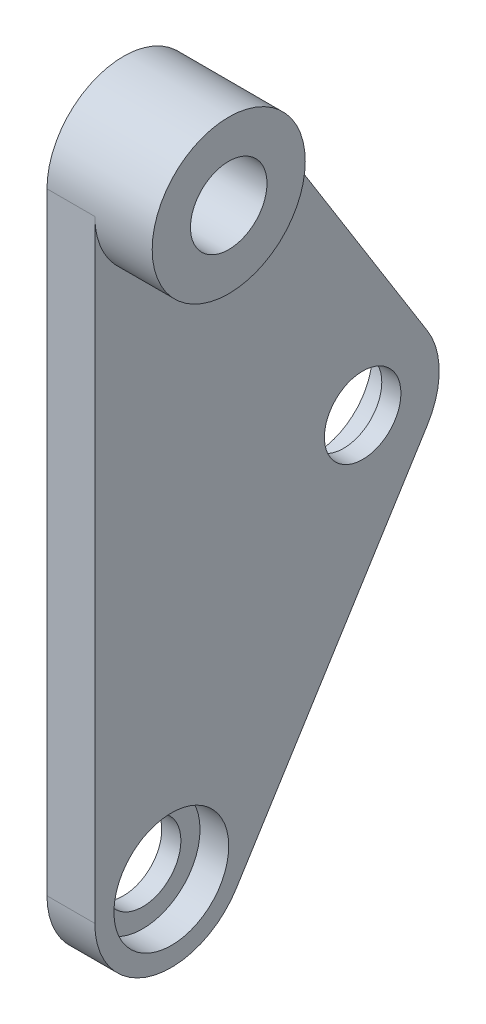
ISO-10303-21;
HEADER;
FILE_DESCRIPTION(('STEP AP214'),'2;1');
FILE_NAME('part.step','',(''),(''),'','','');
FILE_SCHEMA(('AUTOMOTIVE_DESIGN { 1 0 10303 214 1 1 1 1 }'));
ENDSEC;
DATA;
#1=APPLICATION_CONTEXT('core data for automotive mechanical design processes');
#2=APPLICATION_PROTOCOL_DEFINITION('international standard','automotive_design',2000,#1);
#3=PRODUCT_CONTEXT('',#1,'mechanical');
#4=PRODUCT('Part','Part','',(#3));
#5=PRODUCT_RELATED_PRODUCT_CATEGORY('part','',(#4));
#6=PRODUCT_DEFINITION_FORMATION('','',#4);
#7=PRODUCT_DEFINITION_CONTEXT('part definition',#1,'design');
#8=PRODUCT_DEFINITION('design','',#6,#7);
#9=PRODUCT_DEFINITION_SHAPE('','',#8);
#10=(LENGTH_UNIT() NAMED_UNIT(*) SI_UNIT(.MILLI.,.METRE.));
#11=(NAMED_UNIT(*) PLANE_ANGLE_UNIT() SI_UNIT($,.RADIAN.));
#12=(NAMED_UNIT(*) SI_UNIT($,.STERADIAN.) SOLID_ANGLE_UNIT());
#13=UNCERTAINTY_MEASURE_WITH_UNIT(LENGTH_MEASURE(1.E-05),#10,'distance_accuracy_value','');
#14=(GEOMETRIC_REPRESENTATION_CONTEXT(3) GLOBAL_UNCERTAINTY_ASSIGNED_CONTEXT((#13)) GLOBAL_UNIT_ASSIGNED_CONTEXT((#10,
#11,#12)) REPRESENTATION_CONTEXT('',''));
#15=CARTESIAN_POINT('',(0.,0.,0.));
#16=DIRECTION('',(0.,0.,1.));
#17=DIRECTION('',(1.,0.,0.));
#18=AXIS2_PLACEMENT_3D('',#15,#16,#17);
#19=CARTESIAN_POINT('',(4.5,-4.,-4.));
#20=DIRECTION('',(1.,0.,0.));
#21=DIRECTION('',(0.,0.,1.));
#22=AXIS2_PLACEMENT_3D('',#19,#20,#21);
#23=CYLINDRICAL_SURFACE('',#22,2.);
#24=CARTESIAN_POINT('',(10.,-4.,-4.));
#25=DIRECTION('',(1.,0.,0.));
#26=DIRECTION('',(0.,0.,-1.));
#27=AXIS2_PLACEMENT_3D('',#24,#25,#26);
#28=CIRCLE('',#27,2.);
#29=CARTESIAN_POINT('',(10.,-4.,-6.));
#30=VERTEX_POINT('',#29);
#31=EDGE_CURVE('E212',#30,#30,#28,.T.);
#32=ORIENTED_EDGE('',*,*,#31,.T.);
#33=EDGE_LOOP('',(#32));
#34=FACE_BOUND('',#33,.T.);
#35=CARTESIAN_POINT('',(6.,-4.,-4.));
#36=DIRECTION('',(1.,0.,0.));
#37=DIRECTION('',(0.,0.,-1.));
#38=AXIS2_PLACEMENT_3D('',#35,#36,#37);
#39=CIRCLE('',#38,2.);
#40=CARTESIAN_POINT('',(6.,-4.,-6.));
#41=VERTEX_POINT('',#40);
#42=EDGE_CURVE('E215',#41,#41,#39,.F.);
#43=ORIENTED_EDGE('',*,*,#42,.T.);
#44=EDGE_LOOP('',(#43));
#45=FACE_BOUND('',#44,.T.);
#46=ADVANCED_FACE('F102',(#34,#45),#23,.F.);
#47=CARTESIAN_POINT('',(4.5,-20.,-14.));
#48=DIRECTION('',(1.,0.,0.));
#49=DIRECTION('',(0.,0.,1.));
#50=AXIS2_PLACEMENT_3D('',#47,#48,#49);
#51=CYLINDRICAL_SURFACE('',#50,2.);
#52=CARTESIAN_POINT('',(7.,-20.,-14.));
#53=DIRECTION('',(1.,0.,0.));
#54=DIRECTION('',(0.,0.,-1.));
#55=AXIS2_PLACEMENT_3D('',#52,#53,#54);
#56=CIRCLE('',#55,2.);
#57=CARTESIAN_POINT('',(7.,-20.,-16.));
#58=VERTEX_POINT('',#57);
#59=EDGE_CURVE('E233',#58,#58,#56,.F.);
#60=ORIENTED_EDGE('',*,*,#59,.F.);
#61=EDGE_LOOP('',(#60));
#62=FACE_BOUND('',#61,.T.);
#63=CARTESIAN_POINT('',(6.,-20.,-14.));
#64=DIRECTION('',(1.,0.,0.));
#65=DIRECTION('',(0.,0.,-1.));
#66=AXIS2_PLACEMENT_3D('',#63,#64,#65);
#67=CIRCLE('',#66,2.);
#68=CARTESIAN_POINT('',(6.,-20.,-16.));
#69=VERTEX_POINT('',#68);
#70=EDGE_CURVE('E205',#69,#69,#67,.T.);
#71=ORIENTED_EDGE('',*,*,#70,.F.);
#72=EDGE_LOOP('',(#71));
#73=FACE_BOUND('',#72,.T.);
#74=ADVANCED_FACE('F256',(#62,#73),#51,.F.);
#75=CARTESIAN_POINT('',(4.5,2.79415306338351,-4.47064490141361));
#76=DIRECTION('',(0.,0.52999894000318,-0.847998304005088));
#77=DIRECTION('',(0.,0.847998304005088,0.52999894000318));
#78=AXIS2_PLACEMENT_3D('',#75,#76,#77);
#79=PLANE('',#78);
#80=DIRECTION('',(0.,-0.847998304005088,-0.52999894000318));
#81=VECTOR('',#80,1.);
#82=CARTESIAN_POINT('',(7.,2.79415306338351,-4.47064490141361));
#83=LINE('',#82,#81);
#84=CARTESIAN_POINT('',(7.,-1.88000423998728,-7.39199321602035));
#85=VERTEX_POINT('',#84);
#86=CARTESIAN_POINT('',(7.,-17.8800042399873,-17.3919932160204));
#87=VERTEX_POINT('',#86);
#88=EDGE_CURVE('E186',#85,#87,#83,.T.);
#89=ORIENTED_EDGE('',*,*,#88,.T.);
#90=DIRECTION('',(1.,0.,0.));
#91=VECTOR('',#90,1.);
#92=CARTESIAN_POINT('',(4.5,-17.8800042399873,-17.3919932160204));
#93=LINE('',#92,#91);
#94=CARTESIAN_POINT('',(4.5,-17.8800042399873,-17.3919932160204));
#95=VERTEX_POINT('',#94);
#96=EDGE_CURVE('E112',#95,#87,#93,.T.);
#97=ORIENTED_EDGE('',*,*,#96,.F.);
#98=DIRECTION('',(0.,-0.847998304005088,-0.52999894000318));
#99=VECTOR('',#98,1.);
#100=CARTESIAN_POINT('',(4.5,2.79415306338351,-4.47064490141361));
#101=LINE('',#100,#99);
#102=CARTESIAN_POINT('',(4.5,-1.88000423998728,-7.39199321602035));
#103=VERTEX_POINT('',#102);
#104=EDGE_CURVE('E179',#103,#95,#101,.T.);
#105=ORIENTED_EDGE('',*,*,#104,.F.);
#106=DIRECTION('',(1.,0.,0.));
#107=VECTOR('',#106,1.);
#108=CARTESIAN_POINT('',(4.5,-1.88000423998728,-7.39199321602035));
#109=LINE('',#108,#107);
#110=EDGE_CURVE('E197',#103,#85,#109,.T.);
#111=ORIENTED_EDGE('',*,*,#110,.T.);
#112=EDGE_LOOP('',(#89,#97,#105,#111));
#113=FACE_BOUND('',#112,.T.);
#114=ADVANCED_FACE('F262',(#113),#79,.T.);
#115=CARTESIAN_POINT('',(4.5,0.,0.));
#116=DIRECTION('',(0.,0.,-1.));
#117=DIRECTION('',(1.,0.,0.));
#118=AXIS2_PLACEMENT_3D('',#115,#116,#117);
#119=PLANE('',#118);
#120=DIRECTION('',(0.,-1.,0.));
#121=VECTOR('',#120,1.);
#122=CARTESIAN_POINT('',(7.,0.,0.));
#123=LINE('',#122,#121);
#124=CARTESIAN_POINT('',(7.,-4.,0.));
#125=VERTEX_POINT('',#124);
#126=CARTESIAN_POINT('',(7.,-36.,0.));
#127=VERTEX_POINT('',#126);
#128=EDGE_CURVE('E189',#125,#127,#123,.T.);
#129=ORIENTED_EDGE('',*,*,#128,.F.);
#130=DIRECTION('',(1.,0.,0.));
#131=VECTOR('',#130,1.);
#132=CARTESIAN_POINT('',(4.5,-4.,0.));
#133=LINE('',#132,#131);
#134=CARTESIAN_POINT('',(4.5,-4.,0.));
#135=VERTEX_POINT('',#134);
#136=EDGE_CURVE('E174',#135,#125,#133,.T.);
#137=ORIENTED_EDGE('',*,*,#136,.F.);
#138=DIRECTION('',(0.,-1.,0.));
#139=VECTOR('',#138,1.);
#140=CARTESIAN_POINT('',(4.5,0.,0.));
#141=LINE('',#140,#139);
#142=CARTESIAN_POINT('',(4.5,-36.,0.));
#143=VERTEX_POINT('',#142);
#144=EDGE_CURVE('E163',#135,#143,#141,.T.);
#145=ORIENTED_EDGE('',*,*,#144,.T.);
#146=DIRECTION('',(1.,0.,0.));
#147=VECTOR('',#146,1.);
#148=CARTESIAN_POINT('',(4.5,-36.,0.));
#149=LINE('',#148,#147);
#150=EDGE_CURVE('E171',#143,#127,#149,.T.);
#151=ORIENTED_EDGE('',*,*,#150,.T.);
#152=EDGE_LOOP('',(#129,#137,#145,#151));
#153=FACE_BOUND('',#152,.T.);
#154=ADVANCED_FACE('F177',(#153),#119,.F.);
#155=CARTESIAN_POINT('',(4.5,-14.0301081195633,-22.4481729913013));
#156=DIRECTION('',(0.,-0.52999894000318,-0.847998304005088));
#157=DIRECTION('',(0.,0.847998304005088,-0.52999894000318));
#158=AXIS2_PLACEMENT_3D('',#155,#156,#157);
#159=PLANE('',#158);
#160=DIRECTION('',(0.,-0.847998304005088,0.52999894000318));
#161=VECTOR('',#160,1.);
#162=CARTESIAN_POINT('',(7.,-14.0301081195633,-22.4481729913013));
#163=LINE('',#162,#161);
#164=CARTESIAN_POINT('',(7.,-22.1199957600127,-17.3919932160204));
#165=VERTEX_POINT('',#164);
#166=CARTESIAN_POINT('',(7.,-38.1199957600127,-7.39199321602035));
#167=VERTEX_POINT('',#166);
#168=EDGE_CURVE('E183',#165,#167,#163,.T.);
#169=ORIENTED_EDGE('',*,*,#168,.T.);
#170=DIRECTION('',(1.,0.,0.));
#171=VECTOR('',#170,1.);
#172=CARTESIAN_POINT('',(4.5,-38.1199957600127,-7.39199321602035));
#173=LINE('',#172,#171);
#174=CARTESIAN_POINT('',(4.5,-38.1199957600127,-7.39199321602035));
#175=VERTEX_POINT('',#174);
#176=EDGE_CURVE('E175',#175,#167,#173,.T.);
#177=ORIENTED_EDGE('',*,*,#176,.F.);
#178=DIRECTION('',(0.,-0.847998304005088,0.52999894000318));
#179=VECTOR('',#178,1.);
#180=CARTESIAN_POINT('',(4.5,-14.0301081195633,-22.4481729913013));
#181=LINE('',#180,#179);
#182=CARTESIAN_POINT('',(4.5,-22.1199957600127,-17.3919932160204));
#183=VERTEX_POINT('',#182);
#184=EDGE_CURVE('E166',#183,#175,#181,.T.);
#185=ORIENTED_EDGE('',*,*,#184,.F.);
#186=DIRECTION('',(1.,0.,0.));
#187=VECTOR('',#186,1.);
#188=CARTESIAN_POINT('',(4.5,-22.1199957600127,-17.3919932160204));
#189=LINE('',#188,#187);
#190=EDGE_CURVE('E181',#183,#165,#189,.T.);
#191=ORIENTED_EDGE('',*,*,#190,.T.);
#192=EDGE_LOOP('',(#169,#177,#185,#191));
#193=FACE_BOUND('',#192,.T.);
#194=ADVANCED_FACE('F280',(#193),#159,.T.);
#195=CARTESIAN_POINT('',(7.,0.,0.));
#196=DIRECTION('',(-1.,0.,0.));
#197=DIRECTION('',(0.,0.,-1.));
#198=AXIS2_PLACEMENT_3D('',#195,#196,#197);
#199=PLANE('',#198);
#200=CARTESIAN_POINT('',(7.,-36.,-4.));
#201=DIRECTION('',(1.,0.,0.));
#202=DIRECTION('',(0.,0.,-1.));
#203=AXIS2_PLACEMENT_3D('',#200,#201,#202);
#204=CIRCLE('',#203,3.);
#205=CARTESIAN_POINT('',(7.,-36.,-7.));
#206=VERTEX_POINT('',#205);
#207=EDGE_CURVE('E403',#206,#206,#204,.T.);
#208=ORIENTED_EDGE('',*,*,#207,.F.);
#209=EDGE_LOOP('',(#208));
#210=FACE_BOUND('',#209,.T.);
#211=ORIENTED_EDGE('',*,*,#59,.T.);
#212=EDGE_LOOP('',(#211));
#213=FACE_BOUND('',#212,.T.);
#214=ORIENTED_EDGE('',*,*,#128,.T.);
#215=CARTESIAN_POINT('',(7.,-36.,-4.));
#216=DIRECTION('',(1.,0.,0.));
#217=DIRECTION('',(0.,0.,-1.));
#218=AXIS2_PLACEMENT_3D('',#215,#216,#217);
#219=CIRCLE('',#218,4.);
#220=EDGE_CURVE('E141',#127,#167,#219,.T.);
#221=ORIENTED_EDGE('',*,*,#220,.T.);
#222=ORIENTED_EDGE('',*,*,#168,.F.);
#223=CARTESIAN_POINT('',(7.,-20.,-14.));
#224=DIRECTION('',(1.,0.,0.));
#225=DIRECTION('',(0.,0.,-1.));
#226=AXIS2_PLACEMENT_3D('',#223,#224,#225);
#227=CIRCLE('',#226,4.);
#228=EDGE_CURVE('E147',#165,#87,#227,.T.);
#229=ORIENTED_EDGE('',*,*,#228,.T.);
#230=ORIENTED_EDGE('',*,*,#88,.F.);
#231=CARTESIAN_POINT('',(7.,-4.,-4.));
#232=DIRECTION('',(1.,0.,0.));
#233=DIRECTION('',(0.,0.,-1.));
#234=AXIS2_PLACEMENT_3D('',#231,#232,#233);
#235=CIRCLE('',#234,4.);
#236=EDGE_CURVE('E12',#125,#85,#235,.T.);
#237=ORIENTED_EDGE('',*,*,#236,.F.);
#238=EDGE_LOOP('',(#214,#221,#222,#229,#230,#237));
#239=FACE_BOUND('',#238,.T.);
#240=ADVANCED_FACE('F276',(#210,#213,#239),#199,.F.);
#241=CARTESIAN_POINT('',(4.5,0.,0.));
#242=DIRECTION('',(-1.,0.,0.));
#243=DIRECTION('',(0.,0.,-1.));
#244=AXIS2_PLACEMENT_3D('',#241,#242,#243);
#245=PLANE('',#244);
#246=CARTESIAN_POINT('',(4.5,-4.,-4.));
#247=DIRECTION('',(1.,0.,0.));
#248=DIRECTION('',(0.,0.,-1.));
#249=AXIS2_PLACEMENT_3D('',#246,#247,#248);
#250=CIRCLE('',#249,3.);
#251=CARTESIAN_POINT('',(4.5,-4.,-7.));
#252=VERTEX_POINT('',#251);
#253=EDGE_CURVE('E220',#252,#252,#250,.T.);
#254=ORIENTED_EDGE('',*,*,#253,.T.);
#255=EDGE_LOOP('',(#254));
#256=FACE_BOUND('',#255,.T.);
#257=CARTESIAN_POINT('',(4.5,-20.,-14.));
#258=DIRECTION('',(1.,0.,0.));
#259=DIRECTION('',(0.,0.,-1.));
#260=AXIS2_PLACEMENT_3D('',#257,#258,#259);
#261=CIRCLE('',#260,3.);
#262=CARTESIAN_POINT('',(4.5,-20.,-17.));
#263=VERTEX_POINT('',#262);
#264=EDGE_CURVE('E226',#263,#263,#261,.T.);
#265=ORIENTED_EDGE('',*,*,#264,.T.);
#266=EDGE_LOOP('',(#265));
#267=FACE_BOUND('',#266,.T.);
#268=CARTESIAN_POINT('',(4.5,-36.,-4.));
#269=DIRECTION('',(1.,0.,0.));
#270=DIRECTION('',(0.,0.,-1.));
#271=AXIS2_PLACEMENT_3D('',#268,#269,#270);
#272=CIRCLE('',#271,2.);
#273=CARTESIAN_POINT('',(4.5,-36.,-6.));
#274=VERTEX_POINT('',#273);
#275=EDGE_CURVE('E207',#274,#274,#272,.T.);
#276=ORIENTED_EDGE('',*,*,#275,.T.);
#277=EDGE_LOOP('',(#276));
#278=FACE_BOUND('',#277,.T.);
#279=ORIENTED_EDGE('',*,*,#184,.T.);
#280=CARTESIAN_POINT('',(4.5,-36.,-4.));
#281=DIRECTION('',(1.,0.,0.));
#282=DIRECTION('',(0.,0.,-1.));
#283=AXIS2_PLACEMENT_3D('',#280,#281,#282);
#284=CIRCLE('',#283,4.);
#285=EDGE_CURVE('E159',#143,#175,#284,.T.);
#286=ORIENTED_EDGE('',*,*,#285,.F.);
#287=ORIENTED_EDGE('',*,*,#144,.F.);
#288=CARTESIAN_POINT('',(4.5,-4.,-4.));
#289=DIRECTION('',(1.,0.,0.));
#290=DIRECTION('',(0.,0.,-1.));
#291=AXIS2_PLACEMENT_3D('',#288,#289,#290);
#292=CIRCLE('',#291,4.);
#293=EDGE_CURVE('E190',#103,#135,#292,.T.);
#294=ORIENTED_EDGE('',*,*,#293,.F.);
#295=ORIENTED_EDGE('',*,*,#104,.T.);
#296=CARTESIAN_POINT('',(4.5,-20.,-14.));
#297=DIRECTION('',(1.,0.,0.));
#298=DIRECTION('',(0.,0.,-1.));
#299=AXIS2_PLACEMENT_3D('',#296,#297,#298);
#300=CIRCLE('',#299,4.);
#301=EDGE_CURVE('E121',#183,#95,#300,.T.);
#302=ORIENTED_EDGE('',*,*,#301,.F.);
#303=EDGE_LOOP('',(#279,#286,#287,#294,#295,#302));
#304=FACE_BOUND('',#303,.T.);
#305=ADVANCED_FACE('F161',(#256,#267,#278,#304),#245,.T.);
#306=CARTESIAN_POINT('',(4.5,-36.,-4.));
#307=DIRECTION('',(1.,0.,0.));
#308=DIRECTION('',(0.,0.,1.));
#309=AXIS2_PLACEMENT_3D('',#306,#307,#308);
#310=CYLINDRICAL_SURFACE('',#309,4.);
#311=ORIENTED_EDGE('',*,*,#285,.T.);
#312=ORIENTED_EDGE('',*,*,#176,.T.);
#313=ORIENTED_EDGE('',*,*,#220,.F.);
#314=ORIENTED_EDGE('',*,*,#150,.F.);
#315=EDGE_LOOP('',(#311,#312,#313,#314));
#316=FACE_BOUND('',#315,.T.);
#317=ADVANCED_FACE('F104',(#316),#310,.T.);
#318=CARTESIAN_POINT('',(4.5,-20.,-14.));
#319=DIRECTION('',(1.,0.,0.));
#320=DIRECTION('',(0.,0.,1.));
#321=AXIS2_PLACEMENT_3D('',#318,#319,#320);
#322=CYLINDRICAL_SURFACE('',#321,4.);
#323=ORIENTED_EDGE('',*,*,#228,.F.);
#324=ORIENTED_EDGE('',*,*,#190,.F.);
#325=ORIENTED_EDGE('',*,*,#301,.T.);
#326=ORIENTED_EDGE('',*,*,#96,.T.);
#327=EDGE_LOOP('',(#323,#324,#325,#326));
#328=FACE_BOUND('',#327,.T.);
#329=ADVANCED_FACE('F244',(#328),#322,.T.);
#330=CARTESIAN_POINT('',(4.5,-4.,-4.));
#331=DIRECTION('',(1.,0.,0.));
#332=DIRECTION('',(0.,0.,1.));
#333=AXIS2_PLACEMENT_3D('',#330,#331,#332);
#334=CYLINDRICAL_SURFACE('',#333,4.);
#335=ORIENTED_EDGE('',*,*,#293,.T.);
#336=ORIENTED_EDGE('',*,*,#136,.T.);
#337=ORIENTED_EDGE('',*,*,#236,.T.);
#338=ORIENTED_EDGE('',*,*,#110,.F.);
#339=EDGE_LOOP('',(#335,#336,#337,#338));
#340=FACE_BOUND('',#339,.T.);
#341=CARTESIAN_POINT('',(10.,-4.,-4.));
#342=DIRECTION('',(1.,0.,0.));
#343=DIRECTION('',(0.,0.,-1.));
#344=AXIS2_PLACEMENT_3D('',#341,#342,#343);
#345=CIRCLE('',#344,4.);
#346=CARTESIAN_POINT('',(10.,-4.,-8.));
#347=VERTEX_POINT('',#346);
#348=EDGE_CURVE('E204',#347,#347,#345,.T.);
#349=ORIENTED_EDGE('',*,*,#348,.F.);
#350=EDGE_LOOP('',(#349));
#351=FACE_BOUND('',#350,.T.);
#352=ADVANCED_FACE('F242',(#340,#351),#334,.T.);
#353=CARTESIAN_POINT('',(10.,-4.,-4.));
#354=DIRECTION('',(-1.,0.,0.));
#355=DIRECTION('',(0.,0.,-1.));
#356=AXIS2_PLACEMENT_3D('',#353,#354,#355);
#357=PLANE('',#356);
#358=ORIENTED_EDGE('',*,*,#31,.F.);
#359=EDGE_LOOP('',(#358));
#360=FACE_BOUND('',#359,.T.);
#361=ORIENTED_EDGE('',*,*,#348,.T.);
#362=EDGE_LOOP('',(#361));
#363=FACE_BOUND('',#362,.T.);
#364=ADVANCED_FACE('F240',(#360,#363),#357,.F.);
#365=CARTESIAN_POINT('',(4.5,-36.,-4.));
#366=DIRECTION('',(1.,0.,0.));
#367=DIRECTION('',(0.,0.,1.));
#368=AXIS2_PLACEMENT_3D('',#365,#366,#367);
#369=CYLINDRICAL_SURFACE('',#368,2.);
#370=CARTESIAN_POINT('',(5.5,-36.,-4.));
#371=DIRECTION('',(1.,0.,0.));
#372=DIRECTION('',(0.,0.,-1.));
#373=AXIS2_PLACEMENT_3D('',#370,#371,#372);
#374=CIRCLE('',#373,2.);
#375=CARTESIAN_POINT('',(5.5,-36.,-6.));
#376=VERTEX_POINT('',#375);
#377=EDGE_CURVE('E106',#376,#376,#374,.T.);
#378=ORIENTED_EDGE('',*,*,#377,.T.);
#379=EDGE_LOOP('',(#378));
#380=FACE_BOUND('',#379,.T.);
#381=ORIENTED_EDGE('',*,*,#275,.F.);
#382=EDGE_LOOP('',(#381));
#383=FACE_BOUND('',#382,.T.);
#384=ADVANCED_FACE('F251',(#380,#383),#369,.F.);
#385=CARTESIAN_POINT('',(6.,-20.,-14.));
#386=DIRECTION('',(-1.,0.,0.));
#387=DIRECTION('',(0.,0.,-1.));
#388=AXIS2_PLACEMENT_3D('',#385,#386,#387);
#389=CYLINDRICAL_SURFACE('',#388,3.);
#390=CARTESIAN_POINT('',(6.,-20.,-14.));
#391=DIRECTION('',(1.,0.,0.));
#392=DIRECTION('',(0.,0.,-1.));
#393=AXIS2_PLACEMENT_3D('',#390,#391,#392);
#394=CIRCLE('',#393,3.);
#395=CARTESIAN_POINT('',(6.,-20.,-17.));
#396=VERTEX_POINT('',#395);
#397=EDGE_CURVE('E229',#396,#396,#394,.T.);
#398=ORIENTED_EDGE('',*,*,#397,.T.);
#399=EDGE_LOOP('',(#398));
#400=FACE_BOUND('',#399,.T.);
#401=ORIENTED_EDGE('',*,*,#264,.F.);
#402=EDGE_LOOP('',(#401));
#403=FACE_BOUND('',#402,.T.);
#404=ADVANCED_FACE('F271',(#400,#403),#389,.F.);
#405=CARTESIAN_POINT('',(6.,-20.,-14.));
#406=DIRECTION('',(-1.,0.,0.));
#407=DIRECTION('',(0.,0.,-1.));
#408=AXIS2_PLACEMENT_3D('',#405,#406,#407);
#409=PLANE('',#408);
#410=ORIENTED_EDGE('',*,*,#70,.T.);
#411=EDGE_LOOP('',(#410));
#412=FACE_BOUND('',#411,.T.);
#413=ORIENTED_EDGE('',*,*,#397,.F.);
#414=EDGE_LOOP('',(#413));
#415=FACE_BOUND('',#414,.T.);
#416=ADVANCED_FACE('F267',(#412,#415),#409,.T.);
#417=CARTESIAN_POINT('',(6.,-4.,-4.));
#418=DIRECTION('',(-1.,0.,0.));
#419=DIRECTION('',(0.,0.,-1.));
#420=AXIS2_PLACEMENT_3D('',#417,#418,#419);
#421=CYLINDRICAL_SURFACE('',#420,3.);
#422=CARTESIAN_POINT('',(6.,-4.,-4.));
#423=DIRECTION('',(1.,0.,0.));
#424=DIRECTION('',(0.,0.,-1.));
#425=AXIS2_PLACEMENT_3D('',#422,#423,#424);
#426=CIRCLE('',#425,3.);
#427=CARTESIAN_POINT('',(6.,-4.,-7.));
#428=VERTEX_POINT('',#427);
#429=EDGE_CURVE('E208',#428,#428,#426,.T.);
#430=ORIENTED_EDGE('',*,*,#429,.T.);
#431=EDGE_LOOP('',(#430));
#432=FACE_BOUND('',#431,.T.);
#433=ORIENTED_EDGE('',*,*,#253,.F.);
#434=EDGE_LOOP('',(#433));
#435=FACE_BOUND('',#434,.T.);
#436=ADVANCED_FACE('F356',(#432,#435),#421,.F.);
#437=CARTESIAN_POINT('',(6.,0.,0.));
#438=DIRECTION('',(-1.,0.,0.));
#439=DIRECTION('',(0.,0.,-1.));
#440=AXIS2_PLACEMENT_3D('',#437,#438,#439);
#441=PLANE('',#440);
#442=ORIENTED_EDGE('',*,*,#42,.F.);
#443=EDGE_LOOP('',(#442));
#444=FACE_BOUND('',#443,.T.);
#445=ORIENTED_EDGE('',*,*,#429,.F.);
#446=EDGE_LOOP('',(#445));
#447=FACE_BOUND('',#446,.T.);
#448=ADVANCED_FACE('F364',(#444,#447),#441,.T.);
#449=CARTESIAN_POINT('',(5.5,-36.,-4.));
#450=DIRECTION('',(1.,0.,0.));
#451=DIRECTION('',(0.,0.,1.));
#452=AXIS2_PLACEMENT_3D('',#449,#450,#451);
#453=CYLINDRICAL_SURFACE('',#452,3.);
#454=CARTESIAN_POINT('',(5.5,-36.,-4.));
#455=DIRECTION('',(1.,0.,0.));
#456=DIRECTION('',(0.,0.,-1.));
#457=AXIS2_PLACEMENT_3D('',#454,#455,#456);
#458=CIRCLE('',#457,3.);
#459=CARTESIAN_POINT('',(5.5,-36.,-7.));
#460=VERTEX_POINT('',#459);
#461=EDGE_CURVE('E402',#460,#460,#458,.T.);
#462=ORIENTED_EDGE('',*,*,#461,.F.);
#463=EDGE_LOOP('',(#462));
#464=FACE_BOUND('',#463,.T.);
#465=ORIENTED_EDGE('',*,*,#207,.T.);
#466=EDGE_LOOP('',(#465));
#467=FACE_BOUND('',#466,.T.);
#468=ADVANCED_FACE('F373',(#464,#467),#453,.F.);
#469=CARTESIAN_POINT('',(5.5,-36.,-4.));
#470=DIRECTION('',(-1.,0.,0.));
#471=DIRECTION('',(0.,0.,-1.));
#472=AXIS2_PLACEMENT_3D('',#469,#470,#471);
#473=PLANE('',#472);
#474=ORIENTED_EDGE('',*,*,#377,.F.);
#475=EDGE_LOOP('',(#474));
#476=FACE_BOUND('',#475,.T.);
#477=ORIENTED_EDGE('',*,*,#461,.T.);
#478=EDGE_LOOP('',(#477));
#479=FACE_BOUND('',#478,.T.);
#480=ADVANCED_FACE('F383',(#476,#479),#473,.F.);
#481=CLOSED_SHELL('',(#46,#74,#114,#154,#194,#240,#305,#317,#329,#352,#364,#384,#404,#416,#436,
#448,#468,#480));
#482=MANIFOLD_SOLID_BREP('B2',#481);
#483=ADVANCED_BREP_SHAPE_REPRESENTATION('',(#18,#482),#14);
#484=SHAPE_DEFINITION_REPRESENTATION(#9,#483);
ENDSEC;
END-ISO-10303-21;
